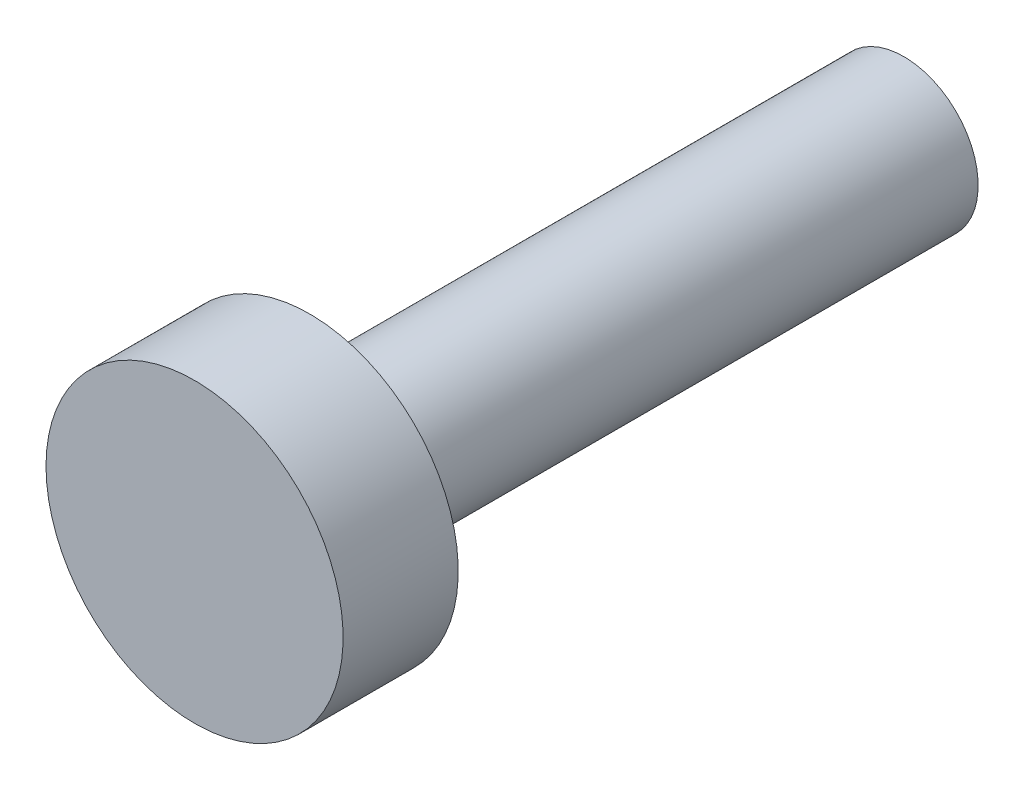
ISO-10303-21;
HEADER;
FILE_DESCRIPTION(('STEP AP214'),'2;1');
FILE_NAME('part.step','',(''),(''),'','','');
FILE_SCHEMA(('AUTOMOTIVE_DESIGN { 1 0 10303 214 1 1 1 1 }'));
ENDSEC;
DATA;
#1=APPLICATION_CONTEXT('core data for automotive mechanical design processes');
#2=APPLICATION_PROTOCOL_DEFINITION('international standard','automotive_design',2000,#1);
#3=PRODUCT_CONTEXT('',#1,'mechanical');
#4=PRODUCT('Part','Part','',(#3));
#5=PRODUCT_RELATED_PRODUCT_CATEGORY('part','',(#4));
#6=PRODUCT_DEFINITION_FORMATION('','',#4);
#7=PRODUCT_DEFINITION_CONTEXT('part definition',#1,'design');
#8=PRODUCT_DEFINITION('design','',#6,#7);
#9=PRODUCT_DEFINITION_SHAPE('','',#8);
#10=(LENGTH_UNIT() NAMED_UNIT(*) SI_UNIT(.MILLI.,.METRE.));
#11=(NAMED_UNIT(*) PLANE_ANGLE_UNIT() SI_UNIT($,.RADIAN.));
#12=(NAMED_UNIT(*) SI_UNIT($,.STERADIAN.) SOLID_ANGLE_UNIT());
#13=UNCERTAINTY_MEASURE_WITH_UNIT(LENGTH_MEASURE(1.E-05),#10,'distance_accuracy_value','');
#14=(GEOMETRIC_REPRESENTATION_CONTEXT(3) GLOBAL_UNCERTAINTY_ASSIGNED_CONTEXT((#13)) GLOBAL_UNIT_ASSIGNED_CONTEXT((#10,
#11,#12)) REPRESENTATION_CONTEXT('',''));
#15=CARTESIAN_POINT('',(0.,0.,0.));
#16=DIRECTION('',(0.,0.,1.));
#17=DIRECTION('',(1.,0.,0.));
#18=AXIS2_PLACEMENT_3D('',#15,#16,#17);
#19=CARTESIAN_POINT('',(0.,0.,3.1));
#20=DIRECTION('',(0.,0.,-1.));
#21=DIRECTION('',(-1.,0.,0.));
#22=AXIS2_PLACEMENT_3D('',#19,#20,#21);
#23=CYLINDRICAL_SURFACE('',#22,4.);
#24=CARTESIAN_POINT('',(0.,0.,3.1));
#25=DIRECTION('',(0.,0.,1.));
#26=DIRECTION('',(1.,0.,0.));
#27=AXIS2_PLACEMENT_3D('',#24,#25,#26);
#28=CIRCLE('',#27,4.);
#29=CARTESIAN_POINT('',(-4.,0.,3.1));
#30=VERTEX_POINT('',#29);
#31=EDGE_CURVE('E38',#30,#30,#28,.T.);
#32=CARTESIAN_POINT('',(0.,0.,0.));
#33=DIRECTION('',(0.,0.,1.));
#34=DIRECTION('',(1.,0.,0.));
#35=AXIS2_PLACEMENT_3D('',#32,#33,#34);
#36=CIRCLE('',#35,4.);
#37=CARTESIAN_POINT('',(-4.,0.,0.));
#38=VERTEX_POINT('',#37);
#39=EDGE_CURVE('E34',#38,#38,#36,.T.);
#40=CARTESIAN_POINT('',(-4.,0.,3.1));
#41=CARTESIAN_POINT('',(-4.,0.,3.06770833333333));
#42=CARTESIAN_POINT('',(-4.,0.,3.03541666666667));
#43=CARTESIAN_POINT('',(-4.,0.,2.97083333333333));
#44=CARTESIAN_POINT('',(-4.,0.,2.93854166666667));
#45=CARTESIAN_POINT('',(-4.,0.,2.87395833333333));
#46=CARTESIAN_POINT('',(-4.,0.,2.84166666666667));
#47=CARTESIAN_POINT('',(-4.,0.,2.77708333333333));
#48=CARTESIAN_POINT('',(-4.,0.,2.74479166666667));
#49=CARTESIAN_POINT('',(-4.,0.,2.68020833333333));
#50=CARTESIAN_POINT('',(-4.,0.,2.64791666666667));
#51=CARTESIAN_POINT('',(-4.,0.,2.58333333333333));
#52=CARTESIAN_POINT('',(-4.,0.,2.55104166666667));
#53=CARTESIAN_POINT('',(-4.,0.,2.48645833333333));
#54=CARTESIAN_POINT('',(-4.,0.,2.45416666666667));
#55=CARTESIAN_POINT('',(-4.,0.,2.38958333333333));
#56=CARTESIAN_POINT('',(-4.,0.,2.35729166666667));
#57=CARTESIAN_POINT('',(-4.,0.,2.29270833333333));
#58=CARTESIAN_POINT('',(-4.,0.,2.26041666666667));
#59=CARTESIAN_POINT('',(-4.,0.,2.19583333333333));
#60=CARTESIAN_POINT('',(-4.,0.,2.16354166666667));
#61=CARTESIAN_POINT('',(-4.,0.,2.09895833333333));
#62=CARTESIAN_POINT('',(-4.,0.,2.06666666666667));
#63=CARTESIAN_POINT('',(-4.,0.,2.00208333333333));
#64=CARTESIAN_POINT('',(-4.,0.,1.96979166666667));
#65=CARTESIAN_POINT('',(-4.,0.,1.90520833333333));
#66=CARTESIAN_POINT('',(-4.,0.,1.87291666666667));
#67=CARTESIAN_POINT('',(-4.,0.,1.80833333333333));
#68=CARTESIAN_POINT('',(-4.,0.,1.77604166666667));
#69=CARTESIAN_POINT('',(-4.,0.,1.71145833333333));
#70=CARTESIAN_POINT('',(-4.,0.,1.67916666666667));
#71=CARTESIAN_POINT('',(-4.,0.,1.61458333333333));
#72=CARTESIAN_POINT('',(-4.,0.,1.58229166666667));
#73=CARTESIAN_POINT('',(-4.,0.,1.51770833333333));
#74=CARTESIAN_POINT('',(-4.,0.,1.48541666666667));
#75=CARTESIAN_POINT('',(-4.,0.,1.42083333333333));
#76=CARTESIAN_POINT('',(-4.,0.,1.38854166666667));
#77=CARTESIAN_POINT('',(-4.,0.,1.32395833333333));
#78=CARTESIAN_POINT('',(-4.,0.,1.29166666666667));
#79=CARTESIAN_POINT('',(-4.,0.,1.22708333333333));
#80=CARTESIAN_POINT('',(-4.,0.,1.19479166666667));
#81=CARTESIAN_POINT('',(-4.,0.,1.13020833333333));
#82=CARTESIAN_POINT('',(-4.,0.,1.09791666666667));
#83=CARTESIAN_POINT('',(-4.,0.,1.03333333333333));
#84=CARTESIAN_POINT('',(-4.,0.,1.00104166666667));
#85=CARTESIAN_POINT('',(-4.,0.,0.936458333333333));
#86=CARTESIAN_POINT('',(-4.,0.,0.904166666666667));
#87=CARTESIAN_POINT('',(-4.,0.,0.839583333333333));
#88=CARTESIAN_POINT('',(-4.,0.,0.807291666666667));
#89=CARTESIAN_POINT('',(-4.,0.,0.742708333333333));
#90=CARTESIAN_POINT('',(-4.,0.,0.710416666666667));
#91=CARTESIAN_POINT('',(-4.,0.,0.645833333333333));
#92=CARTESIAN_POINT('',(-4.,0.,0.613541666666667));
#93=CARTESIAN_POINT('',(-4.,0.,0.548958333333333));
#94=CARTESIAN_POINT('',(-4.,0.,0.516666666666667));
#95=CARTESIAN_POINT('',(-4.,0.,0.452083333333333));
#96=CARTESIAN_POINT('',(-4.,0.,0.419791666666667));
#97=CARTESIAN_POINT('',(-4.,0.,0.355208333333333));
#98=CARTESIAN_POINT('',(-4.,0.,0.322916666666667));
#99=CARTESIAN_POINT('',(-4.,0.,0.258333333333333));
#100=CARTESIAN_POINT('',(-4.,0.,0.226041666666667));
#101=CARTESIAN_POINT('',(-4.,0.,0.161458333333333));
#102=CARTESIAN_POINT('',(-4.,0.,0.129166666666667));
#103=CARTESIAN_POINT('',(-4.,0.,0.0645833333333335));
#104=CARTESIAN_POINT('',(-4.,0.,0.0322916666666667));
#105=CARTESIAN_POINT('',(-4.,0.,0.));
#106=B_SPLINE_CURVE_WITH_KNOTS('',3,(#40,#41,#42,#43,#44,#45,#46,#47,#48,#49,#50,#51,#52,#53,
#54,#55,#56,#57,#58,#59,#60,#61,#62,#63,#64,#65,#66,#67,#68,#69,#70,#71,#72,#73,#74,#75,#76,#77,
#78,#79,#80,#81,#82,#83,#84,#85,#86,#87,#88,#89,#90,#91,#92,#93,#94,#95,#96,#97,#98,#99,#100,
#101,#102,#103,#104,#105),.UNSPECIFIED.,.F.,.F.,(4,2,2,2,2,2,2,2,2,2,2,2,2,2,2,2,2,2,2,2,2,2,2,
2,2,2,2,2,2,2,2,2,4),(0.,0.0968749999999997,0.19375,0.290625,0.3875,0.484375,0.58125,0.678125,
0.775,0.871874999999999,0.96875,1.065625,1.1625,1.259375,1.35625,1.453125,1.55,1.646875,1.74375,
1.840625,1.9375,2.034375,2.13125,2.228125,2.325,2.421875,2.51875,2.615625,2.7125,2.809375,
2.90625,3.003125,3.1),.UNSPECIFIED.);
#107=EDGE_CURVE('BSEAM31',#30,#38,#106,.T.);
#108=ORIENTED_EDGE('',*,*,#31,.F.);
#109=ORIENTED_EDGE('',*,*,#39,.T.);
#110=ORIENTED_EDGE('',*,*,#107,.T.);
#111=ORIENTED_EDGE('',*,*,#107,.F.);
#112=EDGE_LOOP('',(#108,#110,#109,#111));
#113=FACE_BOUND('',#112,.T.);
#114=ADVANCED_FACE('F31',(#113),#23,.T.);
#115=CARTESIAN_POINT('',(0.,0.,3.1));
#116=DIRECTION('',(0.,0.,1.));
#117=DIRECTION('',(1.,0.,0.));
#118=AXIS2_PLACEMENT_3D('',#115,#116,#117);
#119=PLANE('',#118);
#120=ORIENTED_EDGE('',*,*,#31,.T.);
#121=EDGE_LOOP('',(#120));
#122=FACE_BOUND('',#121,.T.);
#123=ADVANCED_FACE('F55',(#122),#119,.T.);
#124=CARTESIAN_POINT('',(0.,0.,0.));
#125=DIRECTION('',(0.,0.,1.));
#126=DIRECTION('',(1.,0.,0.));
#127=AXIS2_PLACEMENT_3D('',#124,#125,#126);
#128=PLANE('',#127);
#129=CARTESIAN_POINT('',(0.,0.,0.));
#130=DIRECTION('',(0.,0.,-1.));
#131=DIRECTION('',(-1.,0.,0.));
#132=AXIS2_PLACEMENT_3D('',#129,#130,#131);
#133=CIRCLE('',#132,2.);
#134=CARTESIAN_POINT('',(-2.,0.,0.));
#135=VERTEX_POINT('',#134);
#136=EDGE_CURVE('E10',#135,#135,#133,.T.);
#137=ORIENTED_EDGE('',*,*,#136,.F.);
#138=EDGE_LOOP('',(#137));
#139=FACE_BOUND('',#138,.T.);
#140=ORIENTED_EDGE('',*,*,#39,.F.);
#141=EDGE_LOOP('',(#140));
#142=FACE_BOUND('',#141,.T.);
#143=ADVANCED_FACE('F52',(#139,#142),#128,.F.);
#144=CARTESIAN_POINT('',(0.,0.,-16.));
#145=DIRECTION('',(0.,0.,1.));
#146=DIRECTION('',(1.,0.,0.));
#147=AXIS2_PLACEMENT_3D('',#144,#145,#146);
#148=CYLINDRICAL_SURFACE('',#147,2.);
#149=CARTESIAN_POINT('',(0.,0.,-16.));
#150=DIRECTION('',(0.,0.,-1.));
#151=DIRECTION('',(-1.,0.,0.));
#152=AXIS2_PLACEMENT_3D('',#149,#150,#151);
#153=CIRCLE('',#152,2.);
#154=CARTESIAN_POINT('',(-2.,0.,-16.));
#155=VERTEX_POINT('',#154);
#156=EDGE_CURVE('E44',#155,#155,#153,.T.);
#157=ORIENTED_EDGE('',*,*,#156,.F.);
#158=EDGE_LOOP('',(#157));
#159=FACE_BOUND('',#158,.T.);
#160=ORIENTED_EDGE('',*,*,#136,.T.);
#161=EDGE_LOOP('',(#160));
#162=FACE_BOUND('',#161,.T.);
#163=ADVANCED_FACE('F54',(#159,#162),#148,.T.);
#164=CARTESIAN_POINT('',(0.,0.,-16.));
#165=DIRECTION('',(0.,0.,-1.));
#166=DIRECTION('',(-1.,0.,0.));
#167=AXIS2_PLACEMENT_3D('',#164,#165,#166);
#168=PLANE('',#167);
#169=ORIENTED_EDGE('',*,*,#156,.T.);
#170=EDGE_LOOP('',(#169));
#171=FACE_BOUND('',#170,.T.);
#172=ADVANCED_FACE('F61',(#171),#168,.T.);
#173=CLOSED_SHELL('',(#114,#123,#143,#163,#172));
#174=MANIFOLD_SOLID_BREP('B2',#173);
#175=ADVANCED_BREP_SHAPE_REPRESENTATION('',(#18,#174),#14);
#176=SHAPE_DEFINITION_REPRESENTATION(#9,#175);
ENDSEC;
END-ISO-10303-21;
